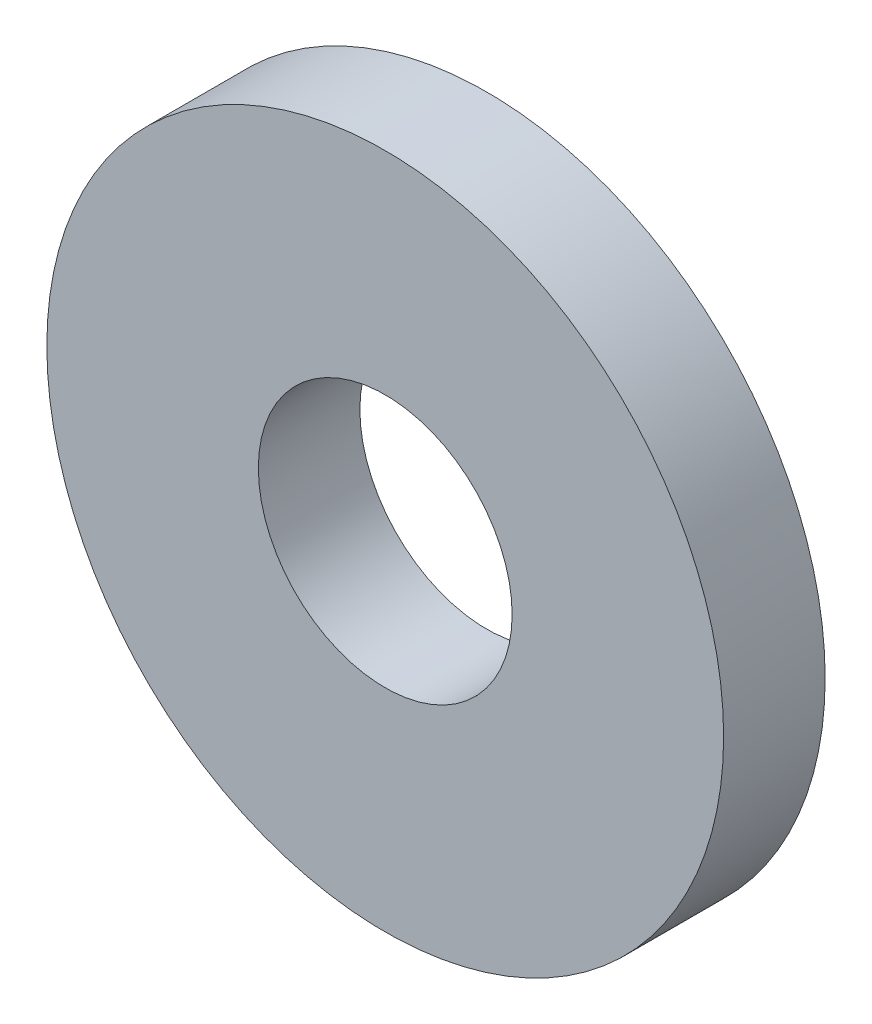
ISO-10303-21;
HEADER;
FILE_DESCRIPTION(('STEP AP214'),'2;1');
FILE_NAME('part.step','',(''),(''),'','','');
FILE_SCHEMA(('AUTOMOTIVE_DESIGN { 1 0 10303 214 1 1 1 1 }'));
ENDSEC;
DATA;
#1=APPLICATION_CONTEXT('core data for automotive mechanical design processes');
#2=APPLICATION_PROTOCOL_DEFINITION('international standard','automotive_design',2000,#1);
#3=PRODUCT_CONTEXT('',#1,'mechanical');
#4=PRODUCT('Part','Part','',(#3));
#5=PRODUCT_RELATED_PRODUCT_CATEGORY('part','',(#4));
#6=PRODUCT_DEFINITION_FORMATION('','',#4);
#7=PRODUCT_DEFINITION_CONTEXT('part definition',#1,'design');
#8=PRODUCT_DEFINITION('design','',#6,#7);
#9=PRODUCT_DEFINITION_SHAPE('','',#8);
#10=(LENGTH_UNIT() NAMED_UNIT(*) SI_UNIT(.MILLI.,.METRE.));
#11=(NAMED_UNIT(*) PLANE_ANGLE_UNIT() SI_UNIT($,.RADIAN.));
#12=(NAMED_UNIT(*) SI_UNIT($,.STERADIAN.) SOLID_ANGLE_UNIT());
#13=UNCERTAINTY_MEASURE_WITH_UNIT(LENGTH_MEASURE(1.E-05),#10,'distance_accuracy_value','');
#14=(GEOMETRIC_REPRESENTATION_CONTEXT(3) GLOBAL_UNCERTAINTY_ASSIGNED_CONTEXT((#13)) GLOBAL_UNIT_ASSIGNED_CONTEXT((#10,
#11,#12)) REPRESENTATION_CONTEXT('',''));
#15=CARTESIAN_POINT('',(0.,0.,0.));
#16=DIRECTION('',(0.,0.,1.));
#17=DIRECTION('',(1.,0.,0.));
#18=AXIS2_PLACEMENT_3D('',#15,#16,#17);
#19=CARTESIAN_POINT('',(0.,0.,12.));
#20=DIRECTION('',(0.,0.,1.));
#21=DIRECTION('',(1.,0.,0.));
#22=AXIS2_PLACEMENT_3D('',#19,#20,#21);
#23=PLANE('',#22);
#24=CARTESIAN_POINT('',(0.,0.,12.));
#25=DIRECTION('',(0.,0.,1.));
#26=DIRECTION('',(1.,0.,0.));
#27=AXIS2_PLACEMENT_3D('',#24,#25,#26);
#28=CIRCLE('',#27,15.);
#29=CARTESIAN_POINT('',(15.,0.,12.));
#30=VERTEX_POINT('',#29);
#31=EDGE_CURVE('E10',#30,#30,#28,.T.);
#32=ORIENTED_EDGE('',*,*,#31,.F.);
#33=EDGE_LOOP('',(#32));
#34=FACE_BOUND('',#33,.T.);
#35=CARTESIAN_POINT('',(0.,0.,12.));
#36=DIRECTION('',(0.,0.,1.));
#37=DIRECTION('',(1.,0.,0.));
#38=AXIS2_PLACEMENT_3D('',#35,#36,#37);
#39=CIRCLE('',#38,40.);
#40=CARTESIAN_POINT('',(40.,0.,12.));
#41=VERTEX_POINT('',#40);
#42=EDGE_CURVE('E41',#41,#41,#39,.T.);
#43=ORIENTED_EDGE('',*,*,#42,.T.);
#44=EDGE_LOOP('',(#43));
#45=FACE_BOUND('',#44,.T.);
#46=ADVANCED_FACE('F16',(#34,#45),#23,.T.);
#47=CARTESIAN_POINT('',(0.,0.,0.));
#48=DIRECTION('',(0.,0.,-1.));
#49=DIRECTION('',(1.,0.,0.));
#50=AXIS2_PLACEMENT_3D('',#47,#48,#49);
#51=CYLINDRICAL_SURFACE('',#50,15.);
#52=CARTESIAN_POINT('',(0.,0.,0.));
#53=DIRECTION('',(0.,0.,1.));
#54=DIRECTION('',(1.,0.,0.));
#55=AXIS2_PLACEMENT_3D('',#52,#53,#54);
#56=CIRCLE('',#55,15.);
#57=CARTESIAN_POINT('',(15.,0.,0.));
#58=VERTEX_POINT('',#57);
#59=EDGE_CURVE('E57',#58,#58,#56,.T.);
#60=ORIENTED_EDGE('',*,*,#59,.F.);
#61=DIRECTION('',(0.,0.,1.));
#62=VECTOR('',#61,1.);
#63=CARTESIAN_POINT('',(15.,0.,0.));
#64=LINE('',#63,#62);
#65=EDGE_CURVE('E24',#58,#30,#64,.T.);
#66=ORIENTED_EDGE('',*,*,#65,.T.);
#67=ORIENTED_EDGE('',*,*,#31,.T.);
#68=ORIENTED_EDGE('',*,*,#65,.F.);
#69=EDGE_LOOP('',(#60,#66,#67,#68));
#70=FACE_BOUND('',#69,.T.);
#71=ADVANCED_FACE('F74',(#70),#51,.F.);
#72=CARTESIAN_POINT('',(0.,0.,0.));
#73=DIRECTION('',(0.,0.,1.));
#74=DIRECTION('',(1.,0.,0.));
#75=AXIS2_PLACEMENT_3D('',#72,#73,#74);
#76=CYLINDRICAL_SURFACE('',#75,40.);
#77=CARTESIAN_POINT('',(0.,0.,0.));
#78=DIRECTION('',(0.,0.,1.));
#79=DIRECTION('',(1.,0.,0.));
#80=AXIS2_PLACEMENT_3D('',#77,#78,#79);
#81=CIRCLE('',#80,40.);
#82=CARTESIAN_POINT('',(40.,0.,0.));
#83=VERTEX_POINT('',#82);
#84=EDGE_CURVE('E55',#83,#83,#81,.T.);
#85=ORIENTED_EDGE('',*,*,#84,.T.);
#86=DIRECTION('',(0.,0.,1.));
#87=VECTOR('',#86,1.);
#88=CARTESIAN_POINT('',(40.,0.,0.));
#89=LINE('',#88,#87);
#90=EDGE_CURVE('E52',#83,#41,#89,.T.);
#91=ORIENTED_EDGE('',*,*,#90,.T.);
#92=ORIENTED_EDGE('',*,*,#42,.F.);
#93=ORIENTED_EDGE('',*,*,#90,.F.);
#94=EDGE_LOOP('',(#85,#91,#92,#93));
#95=FACE_BOUND('',#94,.T.);
#96=ADVANCED_FACE('F53',(#95),#76,.T.);
#97=CARTESIAN_POINT('',(0.,0.,0.));
#98=DIRECTION('',(0.,0.,1.));
#99=DIRECTION('',(1.,0.,0.));
#100=AXIS2_PLACEMENT_3D('',#97,#98,#99);
#101=PLANE('',#100);
#102=ORIENTED_EDGE('',*,*,#59,.T.);
#103=EDGE_LOOP('',(#102));
#104=FACE_BOUND('',#103,.T.);
#105=ORIENTED_EDGE('',*,*,#84,.F.);
#106=EDGE_LOOP('',(#105));
#107=FACE_BOUND('',#106,.T.);
#108=ADVANCED_FACE('F76',(#104,#107),#101,.F.);
#109=CLOSED_SHELL('',(#46,#71,#96,#108));
#110=MANIFOLD_SOLID_BREP('B1',#109);
#111=ADVANCED_BREP_SHAPE_REPRESENTATION('',(#18,#110),#14);
#112=SHAPE_DEFINITION_REPRESENTATION(#9,#111);
ENDSEC;
END-ISO-10303-21;
